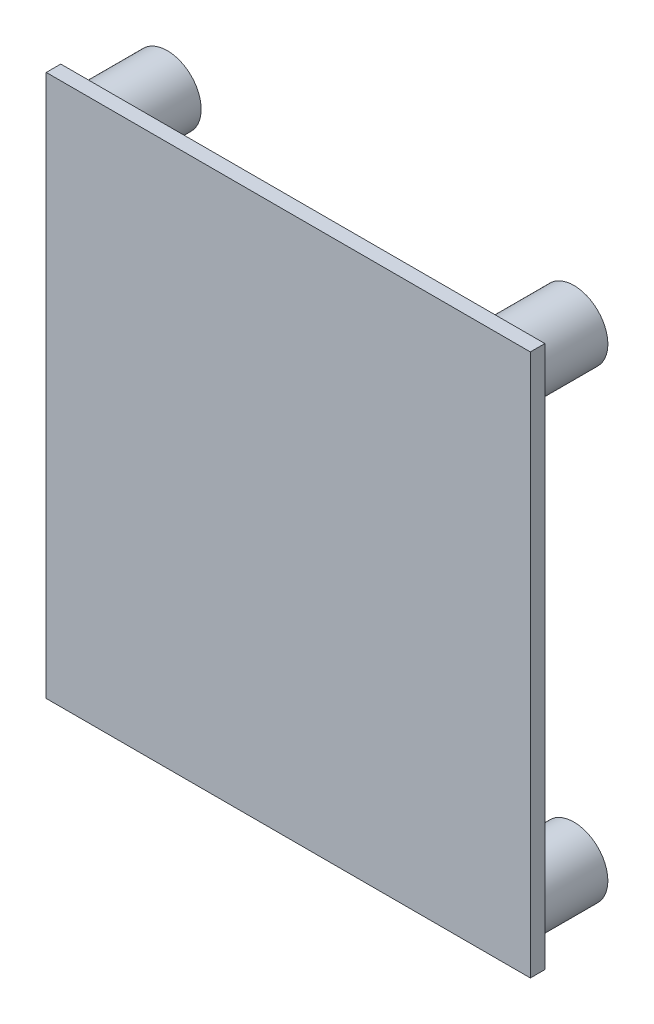
ISO-10303-21;
HEADER;
FILE_DESCRIPTION(('STEP AP214'),'2;1');
FILE_NAME('part.step','',(''),(''),'','','');
FILE_SCHEMA(('AUTOMOTIVE_DESIGN { 1 0 10303 214 1 1 1 1 }'));
ENDSEC;
DATA;
#1=APPLICATION_CONTEXT('core data for automotive mechanical design processes');
#2=APPLICATION_PROTOCOL_DEFINITION('international standard','automotive_design',2000,#1);
#3=PRODUCT_CONTEXT('',#1,'mechanical');
#4=PRODUCT('Part','Part','',(#3));
#5=PRODUCT_RELATED_PRODUCT_CATEGORY('part','',(#4));
#6=PRODUCT_DEFINITION_FORMATION('','',#4);
#7=PRODUCT_DEFINITION_CONTEXT('part definition',#1,'design');
#8=PRODUCT_DEFINITION('design','',#6,#7);
#9=PRODUCT_DEFINITION_SHAPE('','',#8);
#10=(LENGTH_UNIT() NAMED_UNIT(*) SI_UNIT(.MILLI.,.METRE.));
#11=(NAMED_UNIT(*) PLANE_ANGLE_UNIT() SI_UNIT($,.RADIAN.));
#12=(NAMED_UNIT(*) SI_UNIT($,.STERADIAN.) SOLID_ANGLE_UNIT());
#13=UNCERTAINTY_MEASURE_WITH_UNIT(LENGTH_MEASURE(1.E-05),#10,'distance_accuracy_value','');
#14=(GEOMETRIC_REPRESENTATION_CONTEXT(3) GLOBAL_UNCERTAINTY_ASSIGNED_CONTEXT((#13)) GLOBAL_UNIT_ASSIGNED_CONTEXT((#10,
#11,#12)) REPRESENTATION_CONTEXT('',''));
#15=CARTESIAN_POINT('',(0.,0.,0.));
#16=DIRECTION('',(0.,0.,1.));
#17=DIRECTION('',(1.,0.,0.));
#18=AXIS2_PLACEMENT_3D('',#15,#16,#17);
#19=CARTESIAN_POINT('',(0.,0.,1.5));
#20=DIRECTION('',(1.,0.,0.));
#21=DIRECTION('',(0.,1.,0.));
#22=AXIS2_PLACEMENT_3D('',#19,#20,#21);
#23=PLANE('',#22);
#24=DIRECTION('',(0.,-1.,0.));
#25=VECTOR('',#24,1.);
#26=CARTESIAN_POINT('',(0.,0.,0.));
#27=LINE('',#26,#25);
#28=CARTESIAN_POINT('',(0.,56.,0.));
#29=VERTEX_POINT('',#28);
#30=CARTESIAN_POINT('',(0.,0.,0.));
#31=VERTEX_POINT('',#30);
#32=EDGE_CURVE('E111',#29,#31,#27,.T.);
#33=ORIENTED_EDGE('',*,*,#32,.T.);
#34=DIRECTION('',(0.,0.,-1.));
#35=VECTOR('',#34,1.);
#36=CARTESIAN_POINT('',(0.,0.,1.5));
#37=LINE('',#36,#35);
#38=CARTESIAN_POINT('',(0.,0.,1.5));
#39=VERTEX_POINT('',#38);
#40=EDGE_CURVE('E100',#39,#31,#37,.T.);
#41=ORIENTED_EDGE('',*,*,#40,.F.);
#42=DIRECTION('',(0.,-1.,0.));
#43=VECTOR('',#42,1.);
#44=CARTESIAN_POINT('',(0.,0.,1.5));
#45=LINE('',#44,#43);
#46=CARTESIAN_POINT('',(0.,56.,1.5));
#47=VERTEX_POINT('',#46);
#48=EDGE_CURVE('E92',#47,#39,#45,.T.);
#49=ORIENTED_EDGE('',*,*,#48,.F.);
#50=DIRECTION('',(0.,0.,-1.));
#51=VECTOR('',#50,1.);
#52=CARTESIAN_POINT('',(0.,56.,1.5));
#53=LINE('',#52,#51);
#54=EDGE_CURVE('E107',#47,#29,#53,.T.);
#55=ORIENTED_EDGE('',*,*,#54,.T.);
#56=EDGE_LOOP('',(#33,#41,#49,#55));
#57=FACE_BOUND('',#56,.T.);
#58=ADVANCED_FACE('F39',(#57),#23,.F.);
#59=CARTESIAN_POINT('',(0.,0.,1.5));
#60=DIRECTION('',(0.,1.,0.));
#61=DIRECTION('',(0.,0.,1.));
#62=AXIS2_PLACEMENT_3D('',#59,#60,#61);
#63=PLANE('',#62);
#64=DIRECTION('',(1.,0.,0.));
#65=VECTOR('',#64,1.);
#66=CARTESIAN_POINT('',(0.,0.,0.));
#67=LINE('',#66,#65);
#68=CARTESIAN_POINT('',(50.,0.,0.));
#69=VERTEX_POINT('',#68);
#70=EDGE_CURVE('E98',#31,#69,#67,.T.);
#71=ORIENTED_EDGE('',*,*,#70,.T.);
#72=DIRECTION('',(0.,0.,-1.));
#73=VECTOR('',#72,1.);
#74=CARTESIAN_POINT('',(50.,0.,1.5));
#75=LINE('',#74,#73);
#76=CARTESIAN_POINT('',(50.,0.,1.5));
#77=VERTEX_POINT('',#76);
#78=EDGE_CURVE('E96',#77,#69,#75,.T.);
#79=ORIENTED_EDGE('',*,*,#78,.F.);
#80=DIRECTION('',(1.,0.,0.));
#81=VECTOR('',#80,1.);
#82=CARTESIAN_POINT('',(0.,0.,1.5));
#83=LINE('',#82,#81);
#84=EDGE_CURVE('E87',#39,#77,#83,.T.);
#85=ORIENTED_EDGE('',*,*,#84,.F.);
#86=ORIENTED_EDGE('',*,*,#40,.T.);
#87=EDGE_LOOP('',(#71,#79,#85,#86));
#88=FACE_BOUND('',#87,.T.);
#89=ADVANCED_FACE('F97',(#88),#63,.F.);
#90=CARTESIAN_POINT('',(50.,0.,1.5));
#91=DIRECTION('',(-1.,0.,0.));
#92=DIRECTION('',(0.,0.,1.));
#93=AXIS2_PLACEMENT_3D('',#90,#91,#92);
#94=PLANE('',#93);
#95=DIRECTION('',(0.,1.,0.));
#96=VECTOR('',#95,1.);
#97=CARTESIAN_POINT('',(50.,0.,0.));
#98=LINE('',#97,#96);
#99=CARTESIAN_POINT('',(50.,56.,0.));
#100=VERTEX_POINT('',#99);
#101=EDGE_CURVE('E73',#69,#100,#98,.T.);
#102=ORIENTED_EDGE('',*,*,#101,.T.);
#103=DIRECTION('',(0.,0.,-1.));
#104=VECTOR('',#103,1.);
#105=CARTESIAN_POINT('',(50.,56.,1.5));
#106=LINE('',#105,#104);
#107=CARTESIAN_POINT('',(50.,56.,1.5));
#108=VERTEX_POINT('',#107);
#109=EDGE_CURVE('E101',#108,#100,#106,.T.);
#110=ORIENTED_EDGE('',*,*,#109,.F.);
#111=DIRECTION('',(0.,1.,0.));
#112=VECTOR('',#111,1.);
#113=CARTESIAN_POINT('',(50.,0.,1.5));
#114=LINE('',#113,#112);
#115=EDGE_CURVE('E90',#77,#108,#114,.T.);
#116=ORIENTED_EDGE('',*,*,#115,.F.);
#117=ORIENTED_EDGE('',*,*,#78,.T.);
#118=EDGE_LOOP('',(#102,#110,#116,#117));
#119=FACE_BOUND('',#118,.T.);
#120=ADVANCED_FACE('F103',(#119),#94,.F.);
#121=CARTESIAN_POINT('',(0.,56.,1.5));
#122=DIRECTION('',(0.,-1.,0.));
#123=DIRECTION('',(0.,0.,-1.));
#124=AXIS2_PLACEMENT_3D('',#121,#122,#123);
#125=PLANE('',#124);
#126=DIRECTION('',(-1.,0.,0.));
#127=VECTOR('',#126,1.);
#128=CARTESIAN_POINT('',(0.,56.,0.));
#129=LINE('',#128,#127);
#130=EDGE_CURVE('E79',#100,#29,#129,.T.);
#131=ORIENTED_EDGE('',*,*,#130,.T.);
#132=ORIENTED_EDGE('',*,*,#54,.F.);
#133=DIRECTION('',(-1.,0.,0.));
#134=VECTOR('',#133,1.);
#135=CARTESIAN_POINT('',(0.,56.,1.5));
#136=LINE('',#135,#134);
#137=EDGE_CURVE('E56',#108,#47,#136,.T.);
#138=ORIENTED_EDGE('',*,*,#137,.F.);
#139=ORIENTED_EDGE('',*,*,#109,.T.);
#140=EDGE_LOOP('',(#131,#132,#138,#139));
#141=FACE_BOUND('',#140,.T.);
#142=ADVANCED_FACE('F185',(#141),#125,.F.);
#143=CARTESIAN_POINT('',(0.,0.,1.5));
#144=DIRECTION('',(0.,0.,-1.));
#145=DIRECTION('',(-1.,0.,0.));
#146=AXIS2_PLACEMENT_3D('',#143,#144,#145);
#147=PLANE('',#146);
#148=ORIENTED_EDGE('',*,*,#48,.T.);
#149=ORIENTED_EDGE('',*,*,#84,.T.);
#150=ORIENTED_EDGE('',*,*,#115,.T.);
#151=ORIENTED_EDGE('',*,*,#137,.T.);
#152=EDGE_LOOP('',(#148,#149,#150,#151));
#153=FACE_BOUND('',#152,.T.);
#154=ADVANCED_FACE('F88',(#153),#147,.F.);
#155=CARTESIAN_POINT('',(0.,0.,0.));
#156=DIRECTION('',(0.,0.,-1.));
#157=DIRECTION('',(-1.,0.,0.));
#158=AXIS2_PLACEMENT_3D('',#155,#156,#157);
#159=PLANE('',#158);
#160=CARTESIAN_POINT('',(4.,4.2,0.));
#161=DIRECTION('',(0.,0.,-1.));
#162=DIRECTION('',(-1.,0.,0.));
#163=AXIS2_PLACEMENT_3D('',#160,#161,#162);
#164=CIRCLE('',#163,3.5);
#165=CARTESIAN_POINT('',(0.499999999999996,4.2,0.));
#166=VERTEX_POINT('',#165);
#167=EDGE_CURVE('E236',#166,#166,#164,.T.);
#168=ORIENTED_EDGE('',*,*,#167,.F.);
#169=EDGE_LOOP('',(#168));
#170=FACE_BOUND('',#169,.T.);
#171=CARTESIAN_POINT('',(46.,4.2,0.));
#172=DIRECTION('',(0.,0.,-1.));
#173=DIRECTION('',(-1.,0.,0.));
#174=AXIS2_PLACEMENT_3D('',#171,#172,#173);
#175=CIRCLE('',#174,3.5);
#176=CARTESIAN_POINT('',(42.5,4.2,0.));
#177=VERTEX_POINT('',#176);
#178=EDGE_CURVE('E250',#177,#177,#175,.T.);
#179=ORIENTED_EDGE('',*,*,#178,.F.);
#180=EDGE_LOOP('',(#179));
#181=FACE_BOUND('',#180,.T.);
#182=CARTESIAN_POINT('',(4.00000000000001,52.2,0.));
#183=DIRECTION('',(0.,0.,-1.));
#184=DIRECTION('',(-1.,0.,0.));
#185=AXIS2_PLACEMENT_3D('',#182,#183,#184);
#186=CIRCLE('',#185,3.5);
#187=CARTESIAN_POINT('',(0.500000000000005,52.2,0.));
#188=VERTEX_POINT('',#187);
#189=EDGE_CURVE('E262',#188,#188,#186,.T.);
#190=ORIENTED_EDGE('',*,*,#189,.F.);
#191=EDGE_LOOP('',(#190));
#192=FACE_BOUND('',#191,.T.);
#193=CARTESIAN_POINT('',(46.,52.2,0.));
#194=DIRECTION('',(0.,0.,-1.));
#195=DIRECTION('',(-1.,0.,0.));
#196=AXIS2_PLACEMENT_3D('',#193,#194,#195);
#197=CIRCLE('',#196,3.5);
#198=CARTESIAN_POINT('',(42.5,52.2,0.));
#199=VERTEX_POINT('',#198);
#200=EDGE_CURVE('E273',#199,#199,#197,.T.);
#201=ORIENTED_EDGE('',*,*,#200,.F.);
#202=EDGE_LOOP('',(#201));
#203=FACE_BOUND('',#202,.T.);
#204=ORIENTED_EDGE('',*,*,#32,.F.);
#205=ORIENTED_EDGE('',*,*,#130,.F.);
#206=ORIENTED_EDGE('',*,*,#101,.F.);
#207=ORIENTED_EDGE('',*,*,#70,.F.);
#208=EDGE_LOOP('',(#204,#205,#206,#207));
#209=FACE_BOUND('',#208,.T.);
#210=ADVANCED_FACE('F157',(#170,#181,#192,#203,#209),#159,.T.);
#211=CARTESIAN_POINT('',(46.,52.2,-7.));
#212=DIRECTION('',(0.,0.,-1.));
#213=DIRECTION('',(-1.,0.,0.));
#214=AXIS2_PLACEMENT_3D('',#211,#212,#213);
#215=PLANE('',#214);
#216=CARTESIAN_POINT('',(46.,52.2,-7.));
#217=DIRECTION('',(0.,0.,-1.));
#218=DIRECTION('',(-1.,0.,0.));
#219=AXIS2_PLACEMENT_3D('',#216,#217,#218);
#220=CIRCLE('',#219,3.5);
#221=CARTESIAN_POINT('',(42.5,52.2,-7.));
#222=VERTEX_POINT('',#221);
#223=EDGE_CURVE('E115',#222,#222,#220,.T.);
#224=ORIENTED_EDGE('',*,*,#223,.T.);
#225=EDGE_LOOP('',(#224));
#226=FACE_BOUND('',#225,.T.);
#227=CARTESIAN_POINT('',(46.,52.2,-7.));
#228=DIRECTION('',(0.,0.,-1.));
#229=DIRECTION('',(-1.,0.,0.));
#230=AXIS2_PLACEMENT_3D('',#227,#228,#229);
#231=CIRCLE('',#230,1.5);
#232=CARTESIAN_POINT('',(44.5,52.2,-7.));
#233=VERTEX_POINT('',#232);
#234=EDGE_CURVE('E267',#233,#233,#231,.T.);
#235=ORIENTED_EDGE('',*,*,#234,.F.);
#236=EDGE_LOOP('',(#235));
#237=FACE_BOUND('',#236,.T.);
#238=ADVANCED_FACE('F176',(#226,#237),#215,.T.);
#239=CARTESIAN_POINT('',(46.,52.2,-7.));
#240=DIRECTION('',(0.,0.,1.));
#241=DIRECTION('',(1.,0.,0.));
#242=AXIS2_PLACEMENT_3D('',#239,#240,#241);
#243=CYLINDRICAL_SURFACE('',#242,3.5);
#244=ORIENTED_EDGE('',*,*,#223,.F.);
#245=EDGE_LOOP('',(#244));
#246=FACE_BOUND('',#245,.T.);
#247=ORIENTED_EDGE('',*,*,#200,.T.);
#248=EDGE_LOOP('',(#247));
#249=FACE_BOUND('',#248,.T.);
#250=ADVANCED_FACE('F182',(#246,#249),#243,.T.);
#251=CARTESIAN_POINT('',(46.,52.2,-7.));
#252=DIRECTION('',(0.,0.,1.));
#253=DIRECTION('',(1.,0.,0.));
#254=AXIS2_PLACEMENT_3D('',#251,#252,#253);
#255=CYLINDRICAL_SURFACE('',#254,1.5);
#256=ORIENTED_EDGE('',*,*,#234,.T.);
#257=EDGE_LOOP('',(#256));
#258=FACE_BOUND('',#257,.T.);
#259=CARTESIAN_POINT('',(46.,52.2,0.));
#260=DIRECTION('',(0.,0.,-1.));
#261=DIRECTION('',(-1.,0.,0.));
#262=AXIS2_PLACEMENT_3D('',#259,#260,#261);
#263=CIRCLE('',#262,1.5);
#264=CARTESIAN_POINT('',(44.5,52.2,0.));
#265=VERTEX_POINT('',#264);
#266=EDGE_CURVE('E128',#265,#265,#263,.F.);
#267=ORIENTED_EDGE('',*,*,#266,.T.);
#268=EDGE_LOOP('',(#267));
#269=FACE_BOUND('',#268,.T.);
#270=ADVANCED_FACE('F190',(#258,#269),#255,.F.);
#271=ORIENTED_EDGE('',*,*,#266,.F.);
#272=EDGE_LOOP('',(#271));
#273=FACE_BOUND('',#272,.T.);
#274=ADVANCED_FACE('F164',(#273),#159,.T.);
#275=CARTESIAN_POINT('',(4.00000000000001,52.2,-7.));
#276=DIRECTION('',(0.,0.,-1.));
#277=DIRECTION('',(-1.,0.,0.));
#278=AXIS2_PLACEMENT_3D('',#275,#276,#277);
#279=PLANE('',#278);
#280=CARTESIAN_POINT('',(4.00000000000001,52.2,-7.));
#281=DIRECTION('',(0.,0.,-1.));
#282=DIRECTION('',(-1.,0.,0.));
#283=AXIS2_PLACEMENT_3D('',#280,#281,#282);
#284=CIRCLE('',#283,3.5);
#285=CARTESIAN_POINT('',(0.500000000000005,52.2,-7.));
#286=VERTEX_POINT('',#285);
#287=EDGE_CURVE('E263',#286,#286,#284,.T.);
#288=ORIENTED_EDGE('',*,*,#287,.T.);
#289=EDGE_LOOP('',(#288));
#290=FACE_BOUND('',#289,.T.);
#291=CARTESIAN_POINT('',(4.00000000000001,52.2,-7.));
#292=DIRECTION('',(0.,0.,-1.));
#293=DIRECTION('',(-1.,0.,0.));
#294=AXIS2_PLACEMENT_3D('',#291,#292,#293);
#295=CIRCLE('',#294,1.5);
#296=CARTESIAN_POINT('',(2.50000000000001,52.2,-7.));
#297=VERTEX_POINT('',#296);
#298=EDGE_CURVE('E255',#297,#297,#295,.T.);
#299=ORIENTED_EDGE('',*,*,#298,.F.);
#300=EDGE_LOOP('',(#299));
#301=FACE_BOUND('',#300,.T.);
#302=ADVANCED_FACE('F189',(#290,#301),#279,.T.);
#303=CARTESIAN_POINT('',(4.00000000000001,52.2,-7.));
#304=DIRECTION('',(0.,0.,1.));
#305=DIRECTION('',(1.,0.,0.));
#306=AXIS2_PLACEMENT_3D('',#303,#304,#305);
#307=CYLINDRICAL_SURFACE('',#306,3.5);
#308=ORIENTED_EDGE('',*,*,#287,.F.);
#309=EDGE_LOOP('',(#308));
#310=FACE_BOUND('',#309,.T.);
#311=ORIENTED_EDGE('',*,*,#189,.T.);
#312=EDGE_LOOP('',(#311));
#313=FACE_BOUND('',#312,.T.);
#314=ADVANCED_FACE('F196',(#310,#313),#307,.T.);
#315=CARTESIAN_POINT('',(4.00000000000001,52.2,-7.));
#316=DIRECTION('',(0.,0.,1.));
#317=DIRECTION('',(1.,0.,0.));
#318=AXIS2_PLACEMENT_3D('',#315,#316,#317);
#319=CYLINDRICAL_SURFACE('',#318,1.5);
#320=ORIENTED_EDGE('',*,*,#298,.T.);
#321=EDGE_LOOP('',(#320));
#322=FACE_BOUND('',#321,.T.);
#323=CARTESIAN_POINT('',(4.00000000000001,52.2,0.));
#324=DIRECTION('',(0.,0.,-1.));
#325=DIRECTION('',(-1.,0.,0.));
#326=AXIS2_PLACEMENT_3D('',#323,#324,#325);
#327=CIRCLE('',#326,1.5);
#328=CARTESIAN_POINT('',(2.50000000000001,52.2,0.));
#329=VERTEX_POINT('',#328);
#330=EDGE_CURVE('E132',#329,#329,#327,.F.);
#331=ORIENTED_EDGE('',*,*,#330,.T.);
#332=EDGE_LOOP('',(#331));
#333=FACE_BOUND('',#332,.T.);
#334=ADVANCED_FACE('F162',(#322,#333),#319,.F.);
#335=ORIENTED_EDGE('',*,*,#330,.F.);
#336=EDGE_LOOP('',(#335));
#337=FACE_BOUND('',#336,.T.);
#338=ADVANCED_FACE('F145',(#337),#159,.T.);
#339=CARTESIAN_POINT('',(46.,4.2,-7.));
#340=DIRECTION('',(0.,0.,-1.));
#341=DIRECTION('',(-1.,0.,0.));
#342=AXIS2_PLACEMENT_3D('',#339,#340,#341);
#343=PLANE('',#342);
#344=CARTESIAN_POINT('',(46.,4.2,-7.));
#345=DIRECTION('',(0.,0.,-1.));
#346=DIRECTION('',(-1.,0.,0.));
#347=AXIS2_PLACEMENT_3D('',#344,#345,#346);
#348=CIRCLE('',#347,3.5);
#349=CARTESIAN_POINT('',(42.5,4.2,-7.));
#350=VERTEX_POINT('',#349);
#351=EDGE_CURVE('E251',#350,#350,#348,.T.);
#352=ORIENTED_EDGE('',*,*,#351,.T.);
#353=EDGE_LOOP('',(#352));
#354=FACE_BOUND('',#353,.T.);
#355=CARTESIAN_POINT('',(46.,4.2,-7.));
#356=DIRECTION('',(0.,0.,-1.));
#357=DIRECTION('',(-1.,0.,0.));
#358=AXIS2_PLACEMENT_3D('',#355,#356,#357);
#359=CIRCLE('',#358,1.5);
#360=CARTESIAN_POINT('',(44.5,4.2,-7.));
#361=VERTEX_POINT('',#360);
#362=EDGE_CURVE('E245',#361,#361,#359,.T.);
#363=ORIENTED_EDGE('',*,*,#362,.F.);
#364=EDGE_LOOP('',(#363));
#365=FACE_BOUND('',#364,.T.);
#366=ADVANCED_FACE('F161',(#354,#365),#343,.T.);
#367=CARTESIAN_POINT('',(46.,4.2,-7.));
#368=DIRECTION('',(0.,0.,1.));
#369=DIRECTION('',(1.,0.,0.));
#370=AXIS2_PLACEMENT_3D('',#367,#368,#369);
#371=CYLINDRICAL_SURFACE('',#370,3.5);
#372=ORIENTED_EDGE('',*,*,#351,.F.);
#373=EDGE_LOOP('',(#372));
#374=FACE_BOUND('',#373,.T.);
#375=ORIENTED_EDGE('',*,*,#178,.T.);
#376=EDGE_LOOP('',(#375));
#377=FACE_BOUND('',#376,.T.);
#378=ADVANCED_FACE('F154',(#374,#377),#371,.T.);
#379=CARTESIAN_POINT('',(46.,4.2,-7.));
#380=DIRECTION('',(0.,0.,1.));
#381=DIRECTION('',(1.,0.,0.));
#382=AXIS2_PLACEMENT_3D('',#379,#380,#381);
#383=CYLINDRICAL_SURFACE('',#382,1.5);
#384=ORIENTED_EDGE('',*,*,#362,.T.);
#385=EDGE_LOOP('',(#384));
#386=FACE_BOUND('',#385,.T.);
#387=CARTESIAN_POINT('',(46.,4.2,0.));
#388=DIRECTION('',(0.,0.,-1.));
#389=DIRECTION('',(-1.,0.,0.));
#390=AXIS2_PLACEMENT_3D('',#387,#388,#389);
#391=CIRCLE('',#390,1.5);
#392=CARTESIAN_POINT('',(44.5,4.2,0.));
#393=VERTEX_POINT('',#392);
#394=EDGE_CURVE('E48',#393,#393,#391,.F.);
#395=ORIENTED_EDGE('',*,*,#394,.T.);
#396=EDGE_LOOP('',(#395));
#397=FACE_BOUND('',#396,.T.);
#398=ADVANCED_FACE('F139',(#386,#397),#383,.F.);
#399=ORIENTED_EDGE('',*,*,#394,.F.);
#400=EDGE_LOOP('',(#399));
#401=FACE_BOUND('',#400,.T.);
#402=ADVANCED_FACE('F141',(#401),#159,.T.);
#403=CARTESIAN_POINT('',(4.,4.2,-7.));
#404=DIRECTION('',(0.,0.,-1.));
#405=DIRECTION('',(-1.,0.,0.));
#406=AXIS2_PLACEMENT_3D('',#403,#404,#405);
#407=PLANE('',#406);
#408=CARTESIAN_POINT('',(4.,4.2,-7.));
#409=DIRECTION('',(0.,0.,-1.));
#410=DIRECTION('',(-1.,0.,0.));
#411=AXIS2_PLACEMENT_3D('',#408,#409,#410);
#412=CIRCLE('',#411,3.5);
#413=CARTESIAN_POINT('',(0.499999999999996,4.2,-7.));
#414=VERTEX_POINT('',#413);
#415=EDGE_CURVE('E240',#414,#414,#412,.T.);
#416=ORIENTED_EDGE('',*,*,#415,.T.);
#417=EDGE_LOOP('',(#416));
#418=FACE_BOUND('',#417,.T.);
#419=CARTESIAN_POINT('',(4.,4.2,-7.));
#420=DIRECTION('',(0.,0.,-1.));
#421=DIRECTION('',(-1.,0.,0.));
#422=AXIS2_PLACEMENT_3D('',#419,#420,#421);
#423=CIRCLE('',#422,1.5);
#424=CARTESIAN_POINT('',(2.5,4.2,-7.));
#425=VERTEX_POINT('',#424);
#426=EDGE_CURVE('E232',#425,#425,#423,.T.);
#427=ORIENTED_EDGE('',*,*,#426,.F.);
#428=EDGE_LOOP('',(#427));
#429=FACE_BOUND('',#428,.T.);
#430=ADVANCED_FACE('F143',(#418,#429),#407,.T.);
#431=CARTESIAN_POINT('',(4.,4.2,-7.));
#432=DIRECTION('',(0.,0.,1.));
#433=DIRECTION('',(1.,0.,0.));
#434=AXIS2_PLACEMENT_3D('',#431,#432,#433);
#435=CYLINDRICAL_SURFACE('',#434,3.5);
#436=ORIENTED_EDGE('',*,*,#415,.F.);
#437=EDGE_LOOP('',(#436));
#438=FACE_BOUND('',#437,.T.);
#439=ORIENTED_EDGE('',*,*,#167,.T.);
#440=EDGE_LOOP('',(#439));
#441=FACE_BOUND('',#440,.T.);
#442=ADVANCED_FACE('F151',(#438,#441),#435,.T.);
#443=CARTESIAN_POINT('',(4.,4.2,-7.));
#444=DIRECTION('',(0.,0.,1.));
#445=DIRECTION('',(1.,0.,0.));
#446=AXIS2_PLACEMENT_3D('',#443,#444,#445);
#447=CYLINDRICAL_SURFACE('',#446,1.5);
#448=ORIENTED_EDGE('',*,*,#426,.T.);
#449=EDGE_LOOP('',(#448));
#450=FACE_BOUND('',#449,.T.);
#451=CARTESIAN_POINT('',(4.,4.2,0.));
#452=DIRECTION('',(0.,0.,-1.));
#453=DIRECTION('',(-1.,0.,0.));
#454=AXIS2_PLACEMENT_3D('',#451,#452,#453);
#455=CIRCLE('',#454,1.5);
#456=CARTESIAN_POINT('',(2.5,4.2,0.));
#457=VERTEX_POINT('',#456);
#458=EDGE_CURVE('E11',#457,#457,#455,.F.);
#459=ORIENTED_EDGE('',*,*,#458,.T.);
#460=EDGE_LOOP('',(#459));
#461=FACE_BOUND('',#460,.T.);
#462=ADVANCED_FACE('F166',(#450,#461),#447,.F.);
#463=ORIENTED_EDGE('',*,*,#458,.F.);
#464=EDGE_LOOP('',(#463));
#465=FACE_BOUND('',#464,.T.);
#466=ADVANCED_FACE('F146',(#465),#159,.T.);
#467=CLOSED_SHELL('',(#58,#89,#120,#142,#154,#210,#238,#250,#270,#274,#302,#314,#334,#338,#366,
#378,#398,#402,#430,#442,#462,#466));
#468=MANIFOLD_SOLID_BREP('B2',#467);
#469=ADVANCED_BREP_SHAPE_REPRESENTATION('',(#18,#468),#14);
#470=SHAPE_DEFINITION_REPRESENTATION(#9,#469);
ENDSEC;
END-ISO-10303-21;
